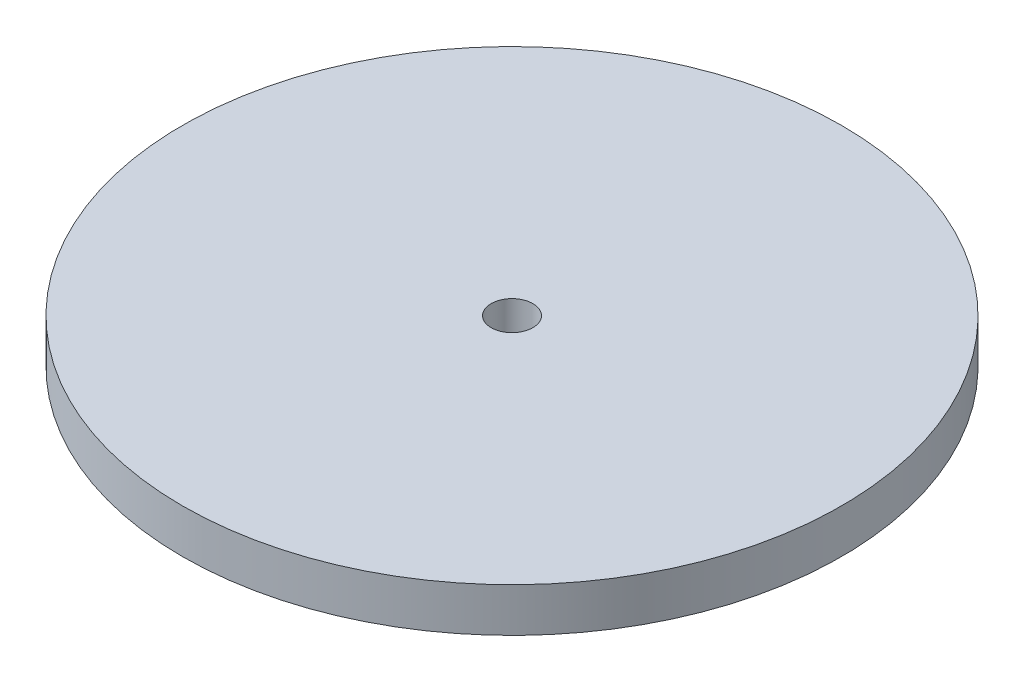
ISO-10303-21;
HEADER;
FILE_DESCRIPTION(('STEP AP214'),'2;1');
FILE_NAME('part.step','',(''),(''),'','','');
FILE_SCHEMA(('AUTOMOTIVE_DESIGN { 1 0 10303 214 1 1 1 1 }'));
ENDSEC;
DATA;
#1=APPLICATION_CONTEXT('core data for automotive mechanical design processes');
#2=APPLICATION_PROTOCOL_DEFINITION('international standard','automotive_design',2000,#1);
#3=PRODUCT_CONTEXT('',#1,'mechanical');
#4=PRODUCT('Part','Part','',(#3));
#5=PRODUCT_RELATED_PRODUCT_CATEGORY('part','',(#4));
#6=PRODUCT_DEFINITION_FORMATION('','',#4);
#7=PRODUCT_DEFINITION_CONTEXT('part definition',#1,'design');
#8=PRODUCT_DEFINITION('design','',#6,#7);
#9=PRODUCT_DEFINITION_SHAPE('','',#8);
#10=(LENGTH_UNIT() NAMED_UNIT(*) SI_UNIT(.MILLI.,.METRE.));
#11=(NAMED_UNIT(*) PLANE_ANGLE_UNIT() SI_UNIT($,.RADIAN.));
#12=(NAMED_UNIT(*) SI_UNIT($,.STERADIAN.) SOLID_ANGLE_UNIT());
#13=UNCERTAINTY_MEASURE_WITH_UNIT(LENGTH_MEASURE(1.E-05),#10,'distance_accuracy_value','');
#14=(GEOMETRIC_REPRESENTATION_CONTEXT(3) GLOBAL_UNCERTAINTY_ASSIGNED_CONTEXT((#13)) GLOBAL_UNIT_ASSIGNED_CONTEXT((#10,
#11,#12)) REPRESENTATION_CONTEXT('',''));
#15=CARTESIAN_POINT('',(0.,0.,0.));
#16=DIRECTION('',(0.,0.,1.));
#17=DIRECTION('',(1.,0.,0.));
#18=AXIS2_PLACEMENT_3D('',#15,#16,#17);
#19=CARTESIAN_POINT('',(0.,2.,0.));
#20=DIRECTION('',(0.,-1.,0.));
#21=DIRECTION('',(0.,0.,-1.));
#22=AXIS2_PLACEMENT_3D('',#19,#20,#21);
#23=CYLINDRICAL_SURFACE('',#22,15.);
#24=CARTESIAN_POINT('',(0.,2.,0.));
#25=DIRECTION('',(0.,1.,0.));
#26=DIRECTION('',(0.,0.,1.));
#27=AXIS2_PLACEMENT_3D('',#24,#25,#26);
#28=CIRCLE('',#27,15.);
#29=CARTESIAN_POINT('',(0.,2.,15.));
#30=VERTEX_POINT('',#29);
#31=EDGE_CURVE('E10',#30,#30,#28,.T.);
#32=ORIENTED_EDGE('',*,*,#31,.F.);
#33=EDGE_LOOP('',(#32));
#34=FACE_BOUND('',#33,.T.);
#35=CARTESIAN_POINT('',(0.,0.,0.));
#36=DIRECTION('',(0.,1.,0.));
#37=DIRECTION('',(0.,0.,1.));
#38=AXIS2_PLACEMENT_3D('',#35,#36,#37);
#39=CIRCLE('',#38,15.);
#40=CARTESIAN_POINT('',(0.,0.,15.));
#41=VERTEX_POINT('',#40);
#42=EDGE_CURVE('E42',#41,#41,#39,.T.);
#43=ORIENTED_EDGE('',*,*,#42,.T.);
#44=EDGE_LOOP('',(#43));
#45=FACE_BOUND('',#44,.T.);
#46=ADVANCED_FACE('F39',(#34,#45),#23,.T.);
#47=CARTESIAN_POINT('',(0.,2.,0.));
#48=DIRECTION('',(0.,1.,0.));
#49=DIRECTION('',(0.,0.,1.));
#50=AXIS2_PLACEMENT_3D('',#47,#48,#49);
#51=PLANE('',#50);
#52=CARTESIAN_POINT('',(0.,2.,0.));
#53=DIRECTION('',(0.,1.,0.));
#54=DIRECTION('',(0.,0.,1.));
#55=AXIS2_PLACEMENT_3D('',#52,#53,#54);
#56=CIRCLE('',#55,0.95);
#57=CARTESIAN_POINT('',(0.,2.,0.95));
#58=VERTEX_POINT('',#57);
#59=EDGE_CURVE('E51',#58,#58,#56,.T.);
#60=ORIENTED_EDGE('',*,*,#59,.F.);
#61=EDGE_LOOP('',(#60));
#62=FACE_BOUND('',#61,.T.);
#63=ORIENTED_EDGE('',*,*,#31,.T.);
#64=EDGE_LOOP('',(#63));
#65=FACE_BOUND('',#64,.T.);
#66=ADVANCED_FACE('F66',(#62,#65),#51,.T.);
#67=CARTESIAN_POINT('',(0.,0.,0.));
#68=DIRECTION('',(0.,1.,0.));
#69=DIRECTION('',(0.,0.,1.));
#70=AXIS2_PLACEMENT_3D('',#67,#68,#69);
#71=PLANE('',#70);
#72=CARTESIAN_POINT('',(0.,0.,0.));
#73=DIRECTION('',(0.,1.,0.));
#74=DIRECTION('',(0.,0.,1.));
#75=AXIS2_PLACEMENT_3D('',#72,#73,#74);
#76=CIRCLE('',#75,0.95);
#77=CARTESIAN_POINT('',(0.,0.,0.95));
#78=VERTEX_POINT('',#77);
#79=EDGE_CURVE('E49',#78,#78,#76,.T.);
#80=ORIENTED_EDGE('',*,*,#79,.T.);
#81=EDGE_LOOP('',(#80));
#82=FACE_BOUND('',#81,.T.);
#83=ORIENTED_EDGE('',*,*,#42,.F.);
#84=EDGE_LOOP('',(#83));
#85=FACE_BOUND('',#84,.T.);
#86=ADVANCED_FACE('F57',(#82,#85),#71,.F.);
#87=CARTESIAN_POINT('',(0.,0.,0.));
#88=DIRECTION('',(0.,1.,0.));
#89=DIRECTION('',(0.,0.,1.));
#90=AXIS2_PLACEMENT_3D('',#87,#88,#89);
#91=CYLINDRICAL_SURFACE('',#90,0.95);
#92=ORIENTED_EDGE('',*,*,#79,.F.);
#93=EDGE_LOOP('',(#92));
#94=FACE_BOUND('',#93,.T.);
#95=ORIENTED_EDGE('',*,*,#59,.T.);
#96=EDGE_LOOP('',(#95));
#97=FACE_BOUND('',#96,.T.);
#98=ADVANCED_FACE('F60',(#94,#97),#91,.F.);
#99=CLOSED_SHELL('',(#46,#66,#86,#98));
#100=MANIFOLD_SOLID_BREP('B2',#99);
#101=ADVANCED_BREP_SHAPE_REPRESENTATION('',(#18,#100),#14);
#102=SHAPE_DEFINITION_REPRESENTATION(#9,#101);
ENDSEC;
END-ISO-10303-21;
